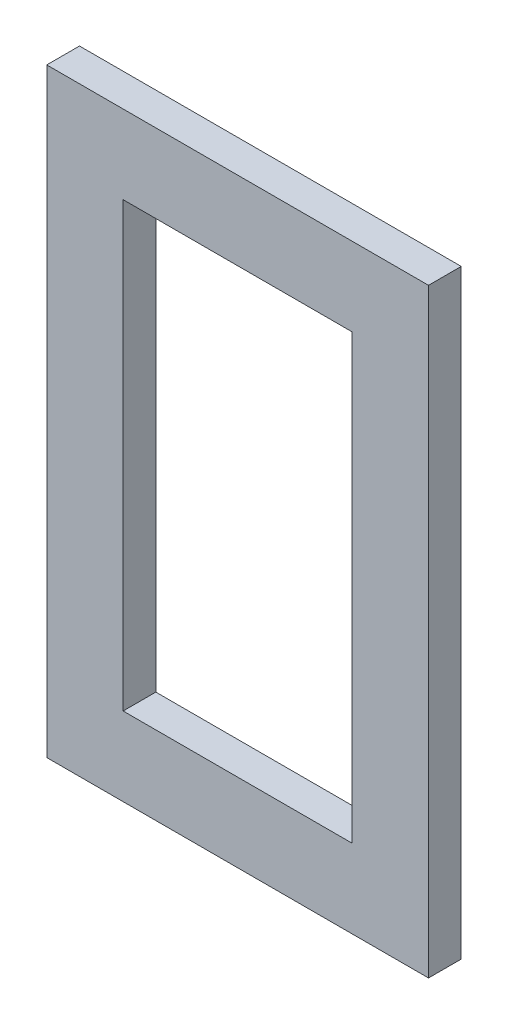
ISO-10303-21;
HEADER;
FILE_DESCRIPTION(('STEP AP214'),'2;1');
FILE_NAME('part.step','',(''),(''),'','','');
FILE_SCHEMA(('AUTOMOTIVE_DESIGN { 1 0 10303 214 1 1 1 1 }'));
ENDSEC;
DATA;
#1=APPLICATION_CONTEXT('core data for automotive mechanical design processes');
#2=APPLICATION_PROTOCOL_DEFINITION('international standard','automotive_design',2000,#1);
#3=PRODUCT_CONTEXT('',#1,'mechanical');
#4=PRODUCT('Part','Part','',(#3));
#5=PRODUCT_RELATED_PRODUCT_CATEGORY('part','',(#4));
#6=PRODUCT_DEFINITION_FORMATION('','',#4);
#7=PRODUCT_DEFINITION_CONTEXT('part definition',#1,'design');
#8=PRODUCT_DEFINITION('design','',#6,#7);
#9=PRODUCT_DEFINITION_SHAPE('','',#8);
#10=(LENGTH_UNIT() NAMED_UNIT(*) SI_UNIT(.MILLI.,.METRE.));
#11=(NAMED_UNIT(*) PLANE_ANGLE_UNIT() SI_UNIT($,.RADIAN.));
#12=(NAMED_UNIT(*) SI_UNIT($,.STERADIAN.) SOLID_ANGLE_UNIT());
#13=UNCERTAINTY_MEASURE_WITH_UNIT(LENGTH_MEASURE(1.E-05),#10,'distance_accuracy_value','');
#14=(GEOMETRIC_REPRESENTATION_CONTEXT(3) GLOBAL_UNCERTAINTY_ASSIGNED_CONTEXT((#13)) GLOBAL_UNIT_ASSIGNED_CONTEXT((#10,
#11,#12)) REPRESENTATION_CONTEXT('',''));
#15=CARTESIAN_POINT('',(0.,0.,0.));
#16=DIRECTION('',(0.,0.,1.));
#17=DIRECTION('',(1.,0.,0.));
#18=AXIS2_PLACEMENT_3D('',#15,#16,#17);
#19=CARTESIAN_POINT('',(-17.5,-27.5,3.));
#20=DIRECTION('',(1.,0.,0.));
#21=DIRECTION('',(0.,0.,-1.));
#22=AXIS2_PLACEMENT_3D('',#19,#20,#21);
#23=PLANE('',#22);
#24=DIRECTION('',(0.,-1.,0.));
#25=VECTOR('',#24,1.);
#26=CARTESIAN_POINT('',(-17.5,-27.5,0.));
#27=LINE('',#26,#25);
#28=CARTESIAN_POINT('',(-17.5,27.5,0.));
#29=VERTEX_POINT('',#28);
#30=CARTESIAN_POINT('',(-17.5,-27.5,0.));
#31=VERTEX_POINT('',#30);
#32=EDGE_CURVE('E130',#29,#31,#27,.T.);
#33=ORIENTED_EDGE('',*,*,#32,.T.);
#34=DIRECTION('',(0.,0.,-1.));
#35=VECTOR('',#34,1.);
#36=CARTESIAN_POINT('',(-17.5,-27.5,3.));
#37=LINE('',#36,#35);
#38=CARTESIAN_POINT('',(-17.5,-27.5,3.));
#39=VERTEX_POINT('',#38);
#40=EDGE_CURVE('E11',#39,#31,#37,.T.);
#41=ORIENTED_EDGE('',*,*,#40,.F.);
#42=DIRECTION('',(0.,-1.,0.));
#43=VECTOR('',#42,1.);
#44=CARTESIAN_POINT('',(-17.5,-27.5,3.));
#45=LINE('',#44,#43);
#46=CARTESIAN_POINT('',(-17.5,27.5,3.));
#47=VERTEX_POINT('',#46);
#48=EDGE_CURVE('E134',#47,#39,#45,.T.);
#49=ORIENTED_EDGE('',*,*,#48,.F.);
#50=DIRECTION('',(0.,0.,-1.));
#51=VECTOR('',#50,1.);
#52=CARTESIAN_POINT('',(-17.5,27.5,3.));
#53=LINE('',#52,#51);
#54=EDGE_CURVE('E144',#47,#29,#53,.T.);
#55=ORIENTED_EDGE('',*,*,#54,.T.);
#56=EDGE_LOOP('',(#33,#41,#49,#55));
#57=FACE_BOUND('',#56,.T.);
#58=ADVANCED_FACE('F33',(#57),#23,.F.);
#59=CARTESIAN_POINT('',(17.5,-27.5,3.));
#60=DIRECTION('',(0.,1.,0.));
#61=DIRECTION('',(-1.,0.,0.));
#62=AXIS2_PLACEMENT_3D('',#59,#60,#61);
#63=PLANE('',#62);
#64=DIRECTION('',(1.,0.,0.));
#65=VECTOR('',#64,1.);
#66=CARTESIAN_POINT('',(17.5,-27.5,0.));
#67=LINE('',#66,#65);
#68=CARTESIAN_POINT('',(17.5,-27.5,0.));
#69=VERTEX_POINT('',#68);
#70=EDGE_CURVE('E147',#31,#69,#67,.T.);
#71=ORIENTED_EDGE('',*,*,#70,.T.);
#72=DIRECTION('',(0.,0.,-1.));
#73=VECTOR('',#72,1.);
#74=CARTESIAN_POINT('',(17.5,-27.5,3.));
#75=LINE('',#74,#73);
#76=CARTESIAN_POINT('',(17.5,-27.5,3.));
#77=VERTEX_POINT('',#76);
#78=EDGE_CURVE('E40',#77,#69,#75,.T.);
#79=ORIENTED_EDGE('',*,*,#78,.F.);
#80=DIRECTION('',(1.,0.,0.));
#81=VECTOR('',#80,1.);
#82=CARTESIAN_POINT('',(17.5,-27.5,3.));
#83=LINE('',#82,#81);
#84=EDGE_CURVE('E137',#39,#77,#83,.T.);
#85=ORIENTED_EDGE('',*,*,#84,.F.);
#86=ORIENTED_EDGE('',*,*,#40,.T.);
#87=EDGE_LOOP('',(#71,#79,#85,#86));
#88=FACE_BOUND('',#87,.T.);
#89=ADVANCED_FACE('F175',(#88),#63,.F.);
#90=CARTESIAN_POINT('',(17.5,-27.5,3.));
#91=DIRECTION('',(-1.,0.,0.));
#92=DIRECTION('',(0.,0.,1.));
#93=AXIS2_PLACEMENT_3D('',#90,#91,#92);
#94=PLANE('',#93);
#95=DIRECTION('',(0.,1.,0.));
#96=VECTOR('',#95,1.);
#97=CARTESIAN_POINT('',(17.5,-27.5,0.));
#98=LINE('',#97,#96);
#99=CARTESIAN_POINT('',(17.5,27.5,0.));
#100=VERTEX_POINT('',#99);
#101=EDGE_CURVE('E149',#69,#100,#98,.T.);
#102=ORIENTED_EDGE('',*,*,#101,.T.);
#103=DIRECTION('',(0.,0.,-1.));
#104=VECTOR('',#103,1.);
#105=CARTESIAN_POINT('',(17.5,27.5,3.));
#106=LINE('',#105,#104);
#107=CARTESIAN_POINT('',(17.5,27.5,3.));
#108=VERTEX_POINT('',#107);
#109=EDGE_CURVE('E154',#108,#100,#106,.T.);
#110=ORIENTED_EDGE('',*,*,#109,.F.);
#111=DIRECTION('',(0.,1.,0.));
#112=VECTOR('',#111,1.);
#113=CARTESIAN_POINT('',(17.5,-27.5,3.));
#114=LINE('',#113,#112);
#115=EDGE_CURVE('E140',#77,#108,#114,.T.);
#116=ORIENTED_EDGE('',*,*,#115,.F.);
#117=ORIENTED_EDGE('',*,*,#78,.T.);
#118=EDGE_LOOP('',(#102,#110,#116,#117));
#119=FACE_BOUND('',#118,.T.);
#120=ADVANCED_FACE('F161',(#119),#94,.F.);
#121=CARTESIAN_POINT('',(17.5,27.5,3.));
#122=DIRECTION('',(0.,-1.,0.));
#123=DIRECTION('',(1.,0.,0.));
#124=AXIS2_PLACEMENT_3D('',#121,#122,#123);
#125=PLANE('',#124);
#126=DIRECTION('',(-1.,0.,0.));
#127=VECTOR('',#126,1.);
#128=CARTESIAN_POINT('',(17.5,27.5,0.));
#129=LINE('',#128,#127);
#130=EDGE_CURVE('E138',#100,#29,#129,.T.);
#131=ORIENTED_EDGE('',*,*,#130,.T.);
#132=ORIENTED_EDGE('',*,*,#54,.F.);
#133=DIRECTION('',(-1.,0.,0.));
#134=VECTOR('',#133,1.);
#135=CARTESIAN_POINT('',(17.5,27.5,3.));
#136=LINE('',#135,#134);
#137=EDGE_CURVE('E142',#108,#47,#136,.T.);
#138=ORIENTED_EDGE('',*,*,#137,.F.);
#139=ORIENTED_EDGE('',*,*,#109,.T.);
#140=EDGE_LOOP('',(#131,#132,#138,#139));
#141=FACE_BOUND('',#140,.T.);
#142=ADVANCED_FACE('F168',(#141),#125,.F.);
#143=CARTESIAN_POINT('',(0.,0.,3.));
#144=DIRECTION('',(0.,0.,1.));
#145=DIRECTION('',(1.,0.,0.));
#146=AXIS2_PLACEMENT_3D('',#143,#144,#145);
#147=PLANE('',#146);
#148=DIRECTION('',(0.,-1.,0.));
#149=VECTOR('',#148,1.);
#150=CARTESIAN_POINT('',(-10.5,-20.3,3.));
#151=LINE('',#150,#149);
#152=CARTESIAN_POINT('',(-10.5,20.3,3.));
#153=VERTEX_POINT('',#152);
#154=CARTESIAN_POINT('',(-10.5,-20.3,3.));
#155=VERTEX_POINT('',#154);
#156=EDGE_CURVE('E47',#153,#155,#151,.T.);
#157=ORIENTED_EDGE('',*,*,#156,.F.);
#158=DIRECTION('',(-1.,0.,0.));
#159=VECTOR('',#158,1.);
#160=CARTESIAN_POINT('',(10.5,20.3,3.));
#161=LINE('',#160,#159);
#162=CARTESIAN_POINT('',(10.5,20.3,3.));
#163=VERTEX_POINT('',#162);
#164=EDGE_CURVE('E115',#163,#153,#161,.T.);
#165=ORIENTED_EDGE('',*,*,#164,.F.);
#166=DIRECTION('',(0.,1.,0.));
#167=VECTOR('',#166,1.);
#168=CARTESIAN_POINT('',(10.5,-20.3,3.));
#169=LINE('',#168,#167);
#170=CARTESIAN_POINT('',(10.5,-20.3,3.));
#171=VERTEX_POINT('',#170);
#172=EDGE_CURVE('E118',#171,#163,#169,.T.);
#173=ORIENTED_EDGE('',*,*,#172,.F.);
#174=DIRECTION('',(1.,0.,0.));
#175=VECTOR('',#174,1.);
#176=CARTESIAN_POINT('',(10.5,-20.3,3.));
#177=LINE('',#176,#175);
#178=EDGE_CURVE('E124',#155,#171,#177,.T.);
#179=ORIENTED_EDGE('',*,*,#178,.F.);
#180=EDGE_LOOP('',(#157,#165,#173,#179));
#181=FACE_BOUND('',#180,.T.);
#182=ORIENTED_EDGE('',*,*,#48,.T.);
#183=ORIENTED_EDGE('',*,*,#84,.T.);
#184=ORIENTED_EDGE('',*,*,#115,.T.);
#185=ORIENTED_EDGE('',*,*,#137,.T.);
#186=EDGE_LOOP('',(#182,#183,#184,#185));
#187=FACE_BOUND('',#186,.T.);
#188=ADVANCED_FACE('F174',(#181,#187),#147,.T.);
#189=CARTESIAN_POINT('',(0.,0.,0.));
#190=DIRECTION('',(0.,0.,1.));
#191=DIRECTION('',(1.,0.,0.));
#192=AXIS2_PLACEMENT_3D('',#189,#190,#191);
#193=PLANE('',#192);
#194=DIRECTION('',(-1.,0.,0.));
#195=VECTOR('',#194,1.);
#196=CARTESIAN_POINT('',(10.5,20.3,0.));
#197=LINE('',#196,#195);
#198=CARTESIAN_POINT('',(10.5,20.3,0.));
#199=VERTEX_POINT('',#198);
#200=CARTESIAN_POINT('',(-10.5,20.3,0.));
#201=VERTEX_POINT('',#200);
#202=EDGE_CURVE('E105',#199,#201,#197,.T.);
#203=ORIENTED_EDGE('',*,*,#202,.T.);
#204=DIRECTION('',(0.,-1.,0.));
#205=VECTOR('',#204,1.);
#206=CARTESIAN_POINT('',(-10.5,-20.3,0.));
#207=LINE('',#206,#205);
#208=CARTESIAN_POINT('',(-10.5,-20.3,0.));
#209=VERTEX_POINT('',#208);
#210=EDGE_CURVE('E99',#201,#209,#207,.T.);
#211=ORIENTED_EDGE('',*,*,#210,.T.);
#212=DIRECTION('',(1.,0.,0.));
#213=VECTOR('',#212,1.);
#214=CARTESIAN_POINT('',(10.5,-20.3,0.));
#215=LINE('',#214,#213);
#216=CARTESIAN_POINT('',(10.5,-20.3,0.));
#217=VERTEX_POINT('',#216);
#218=EDGE_CURVE('E108',#209,#217,#215,.T.);
#219=ORIENTED_EDGE('',*,*,#218,.T.);
#220=DIRECTION('',(0.,1.,0.));
#221=VECTOR('',#220,1.);
#222=CARTESIAN_POINT('',(10.5,-20.3,0.));
#223=LINE('',#222,#221);
#224=EDGE_CURVE('E55',#217,#199,#223,.T.);
#225=ORIENTED_EDGE('',*,*,#224,.T.);
#226=EDGE_LOOP('',(#203,#211,#219,#225));
#227=FACE_BOUND('',#226,.T.);
#228=ORIENTED_EDGE('',*,*,#32,.F.);
#229=ORIENTED_EDGE('',*,*,#130,.F.);
#230=ORIENTED_EDGE('',*,*,#101,.F.);
#231=ORIENTED_EDGE('',*,*,#70,.F.);
#232=EDGE_LOOP('',(#228,#229,#230,#231));
#233=FACE_BOUND('',#232,.T.);
#234=ADVANCED_FACE('F112',(#227,#233),#193,.F.);
#235=CARTESIAN_POINT('',(-10.5,-20.3,0.));
#236=DIRECTION('',(-1.,0.,0.));
#237=DIRECTION('',(0.,0.,1.));
#238=AXIS2_PLACEMENT_3D('',#235,#236,#237);
#239=PLANE('',#238);
#240=ORIENTED_EDGE('',*,*,#156,.T.);
#241=DIRECTION('',(0.,0.,1.));
#242=VECTOR('',#241,1.);
#243=CARTESIAN_POINT('',(-10.5,-20.3,0.));
#244=LINE('',#243,#242);
#245=EDGE_CURVE('E95',#209,#155,#244,.T.);
#246=ORIENTED_EDGE('',*,*,#245,.F.);
#247=ORIENTED_EDGE('',*,*,#210,.F.);
#248=DIRECTION('',(0.,0.,1.));
#249=VECTOR('',#248,1.);
#250=CARTESIAN_POINT('',(-10.5,20.3,0.));
#251=LINE('',#250,#249);
#252=EDGE_CURVE('E128',#201,#153,#251,.T.);
#253=ORIENTED_EDGE('',*,*,#252,.T.);
#254=EDGE_LOOP('',(#240,#246,#247,#253));
#255=FACE_BOUND('',#254,.T.);
#256=ADVANCED_FACE('F97',(#255),#239,.F.);
#257=CARTESIAN_POINT('',(10.5,20.3,0.));
#258=DIRECTION('',(0.,1.,0.));
#259=DIRECTION('',(0.,0.,1.));
#260=AXIS2_PLACEMENT_3D('',#257,#258,#259);
#261=PLANE('',#260);
#262=ORIENTED_EDGE('',*,*,#164,.T.);
#263=ORIENTED_EDGE('',*,*,#252,.F.);
#264=ORIENTED_EDGE('',*,*,#202,.F.);
#265=DIRECTION('',(0.,0.,1.));
#266=VECTOR('',#265,1.);
#267=CARTESIAN_POINT('',(10.5,20.3,0.));
#268=LINE('',#267,#266);
#269=EDGE_CURVE('E131',#199,#163,#268,.T.);
#270=ORIENTED_EDGE('',*,*,#269,.T.);
#271=EDGE_LOOP('',(#262,#263,#264,#270));
#272=FACE_BOUND('',#271,.T.);
#273=ADVANCED_FACE('F192',(#272),#261,.F.);
#274=CARTESIAN_POINT('',(10.5,-20.3,0.));
#275=DIRECTION('',(1.,0.,0.));
#276=DIRECTION('',(0.,0.,-1.));
#277=AXIS2_PLACEMENT_3D('',#274,#275,#276);
#278=PLANE('',#277);
#279=ORIENTED_EDGE('',*,*,#172,.T.);
#280=ORIENTED_EDGE('',*,*,#269,.F.);
#281=ORIENTED_EDGE('',*,*,#224,.F.);
#282=DIRECTION('',(0.,0.,1.));
#283=VECTOR('',#282,1.);
#284=CARTESIAN_POINT('',(10.5,-20.3,0.));
#285=LINE('',#284,#283);
#286=EDGE_CURVE('E104',#217,#171,#285,.T.);
#287=ORIENTED_EDGE('',*,*,#286,.T.);
#288=EDGE_LOOP('',(#279,#280,#281,#287));
#289=FACE_BOUND('',#288,.T.);
#290=ADVANCED_FACE('F195',(#289),#278,.F.);
#291=CARTESIAN_POINT('',(10.5,-20.3,0.));
#292=DIRECTION('',(0.,-1.,0.));
#293=DIRECTION('',(1.,0.,0.));
#294=AXIS2_PLACEMENT_3D('',#291,#292,#293);
#295=PLANE('',#294);
#296=ORIENTED_EDGE('',*,*,#178,.T.);
#297=ORIENTED_EDGE('',*,*,#286,.F.);
#298=ORIENTED_EDGE('',*,*,#218,.F.);
#299=ORIENTED_EDGE('',*,*,#245,.T.);
#300=EDGE_LOOP('',(#296,#297,#298,#299));
#301=FACE_BOUND('',#300,.T.);
#302=ADVANCED_FACE('F109',(#301),#295,.F.);
#303=CLOSED_SHELL('',(#58,#89,#120,#142,#188,#234,#256,#273,#290,#302));
#304=MANIFOLD_SOLID_BREP('B2',#303);
#305=ADVANCED_BREP_SHAPE_REPRESENTATION('',(#18,#304),#14);
#306=SHAPE_DEFINITION_REPRESENTATION(#9,#305);
ENDSEC;
END-ISO-10303-21;
